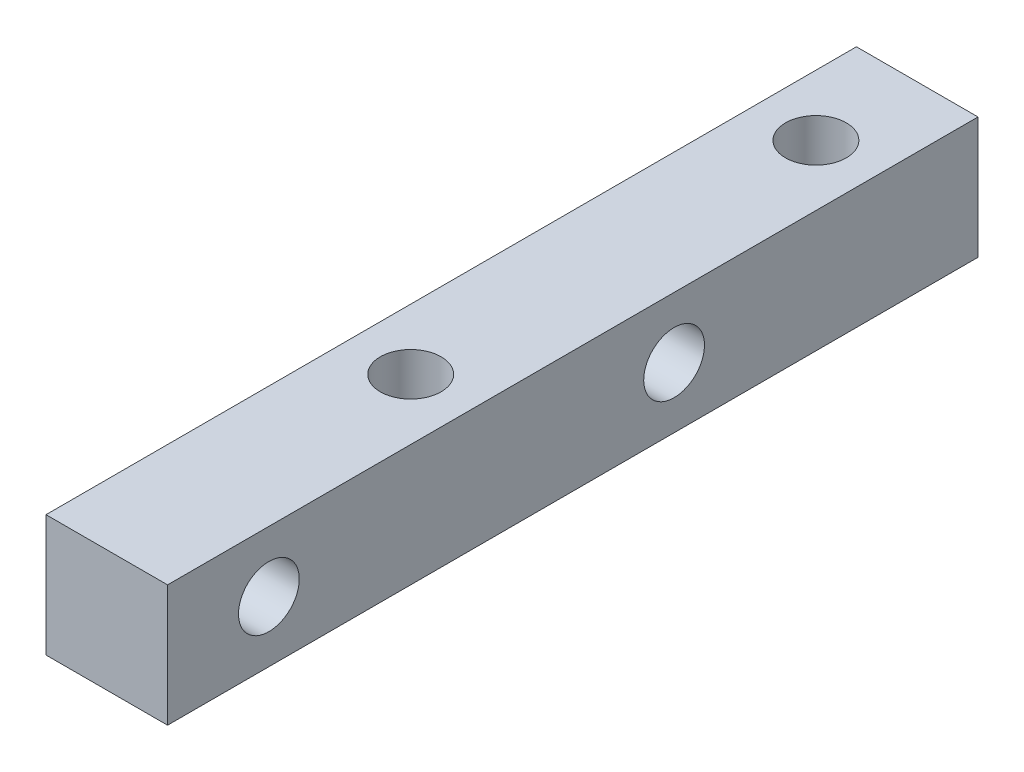
ISO-10303-21;
HEADER;
FILE_DESCRIPTION(('STEP AP214'),'2;1');
FILE_NAME('part.step','',(''),(''),'','','');
FILE_SCHEMA(('AUTOMOTIVE_DESIGN { 1 0 10303 214 1 1 1 1 }'));
ENDSEC;
DATA;
#1=APPLICATION_CONTEXT('core data for automotive mechanical design processes');
#2=APPLICATION_PROTOCOL_DEFINITION('international standard','automotive_design',2000,#1);
#3=PRODUCT_CONTEXT('',#1,'mechanical');
#4=PRODUCT('Part','Part','',(#3));
#5=PRODUCT_RELATED_PRODUCT_CATEGORY('part','',(#4));
#6=PRODUCT_DEFINITION_FORMATION('','',#4);
#7=PRODUCT_DEFINITION_CONTEXT('part definition',#1,'design');
#8=PRODUCT_DEFINITION('design','',#6,#7);
#9=PRODUCT_DEFINITION_SHAPE('','',#8);
#10=(LENGTH_UNIT() NAMED_UNIT(*) SI_UNIT(.MILLI.,.METRE.));
#11=(NAMED_UNIT(*) PLANE_ANGLE_UNIT() SI_UNIT($,.RADIAN.));
#12=(NAMED_UNIT(*) SI_UNIT($,.STERADIAN.) SOLID_ANGLE_UNIT());
#13=UNCERTAINTY_MEASURE_WITH_UNIT(LENGTH_MEASURE(1.E-05),#10,'distance_accuracy_value','');
#14=(GEOMETRIC_REPRESENTATION_CONTEXT(3) GLOBAL_UNCERTAINTY_ASSIGNED_CONTEXT((#13)) GLOBAL_UNIT_ASSIGNED_CONTEXT((#10,
#11,#12)) REPRESENTATION_CONTEXT('',''));
#15=CARTESIAN_POINT('',(0.,0.,0.));
#16=DIRECTION('',(0.,0.,1.));
#17=DIRECTION('',(1.,0.,0.));
#18=AXIS2_PLACEMENT_3D('',#15,#16,#17);
#19=CARTESIAN_POINT('',(3.,3.,20.));
#20=DIRECTION('',(-1.,0.,0.));
#21=DIRECTION('',(0.,-1.,0.));
#22=AXIS2_PLACEMENT_3D('',#19,#20,#21);
#23=PLANE('',#22);
#24=CARTESIAN_POINT('',(3.,0.,15.));
#25=DIRECTION('',(1.,0.,0.));
#26=DIRECTION('',(0.,1.,0.));
#27=AXIS2_PLACEMENT_3D('',#24,#25,#26);
#28=CIRCLE('',#27,1.5);
#29=CARTESIAN_POINT('',(3.,1.5,15.));
#30=VERTEX_POINT('',#29);
#31=EDGE_CURVE('E119',#30,#30,#28,.T.);
#32=ORIENTED_EDGE('',*,*,#31,.F.);
#33=EDGE_LOOP('',(#32));
#34=FACE_BOUND('',#33,.T.);
#35=CARTESIAN_POINT('',(3.,0.,-5.));
#36=DIRECTION('',(1.,0.,0.));
#37=DIRECTION('',(0.,1.,0.));
#38=AXIS2_PLACEMENT_3D('',#35,#36,#37);
#39=CIRCLE('',#38,1.5);
#40=CARTESIAN_POINT('',(3.,1.5,-5.));
#41=VERTEX_POINT('',#40);
#42=EDGE_CURVE('E120',#41,#41,#39,.T.);
#43=ORIENTED_EDGE('',*,*,#42,.F.);
#44=EDGE_LOOP('',(#43));
#45=FACE_BOUND('',#44,.T.);
#46=DIRECTION('',(0.,1.,0.));
#47=VECTOR('',#46,1.);
#48=CARTESIAN_POINT('',(3.,3.,-20.));
#49=LINE('',#48,#47);
#50=CARTESIAN_POINT('',(3.,-3.,-20.));
#51=VERTEX_POINT('',#50);
#52=CARTESIAN_POINT('',(3.,3.,-20.));
#53=VERTEX_POINT('',#52);
#54=EDGE_CURVE('E102',#51,#53,#49,.T.);
#55=ORIENTED_EDGE('',*,*,#54,.T.);
#56=DIRECTION('',(0.,0.,-1.));
#57=VECTOR('',#56,1.);
#58=CARTESIAN_POINT('',(3.,3.,20.));
#59=LINE('',#58,#57);
#60=CARTESIAN_POINT('',(3.,3.,20.));
#61=VERTEX_POINT('',#60);
#62=EDGE_CURVE('E11',#61,#53,#59,.T.);
#63=ORIENTED_EDGE('',*,*,#62,.F.);
#64=DIRECTION('',(0.,1.,0.));
#65=VECTOR('',#64,1.);
#66=CARTESIAN_POINT('',(3.,3.,20.));
#67=LINE('',#66,#65);
#68=CARTESIAN_POINT('',(3.,-3.,20.));
#69=VERTEX_POINT('',#68);
#70=EDGE_CURVE('E90',#69,#61,#67,.T.);
#71=ORIENTED_EDGE('',*,*,#70,.F.);
#72=DIRECTION('',(0.,0.,-1.));
#73=VECTOR('',#72,1.);
#74=CARTESIAN_POINT('',(3.,-3.,20.));
#75=LINE('',#74,#73);
#76=EDGE_CURVE('E98',#69,#51,#75,.T.);
#77=ORIENTED_EDGE('',*,*,#76,.T.);
#78=EDGE_LOOP('',(#55,#63,#71,#77));
#79=FACE_BOUND('',#78,.T.);
#80=ADVANCED_FACE('F39',(#34,#45,#79),#23,.F.);
#81=CARTESIAN_POINT('',(-3.,3.,20.));
#82=DIRECTION('',(0.,-1.,0.));
#83=DIRECTION('',(0.,0.,-1.));
#84=AXIS2_PLACEMENT_3D('',#81,#82,#83);
#85=PLANE('',#84);
#86=CARTESIAN_POINT('',(0.,3.,-15.));
#87=DIRECTION('',(0.,1.,0.));
#88=DIRECTION('',(0.,0.,1.));
#89=AXIS2_PLACEMENT_3D('',#86,#87,#88);
#90=CIRCLE('',#89,1.5);
#91=CARTESIAN_POINT('',(0.,3.,-13.5));
#92=VERTEX_POINT('',#91);
#93=EDGE_CURVE('E131',#92,#92,#90,.T.);
#94=ORIENTED_EDGE('',*,*,#93,.F.);
#95=EDGE_LOOP('',(#94));
#96=FACE_BOUND('',#95,.T.);
#97=CARTESIAN_POINT('',(0.,3.,5.));
#98=DIRECTION('',(0.,1.,0.));
#99=DIRECTION('',(0.,0.,1.));
#100=AXIS2_PLACEMENT_3D('',#97,#98,#99);
#101=CIRCLE('',#100,1.5);
#102=CARTESIAN_POINT('',(0.,3.,6.5));
#103=VERTEX_POINT('',#102);
#104=EDGE_CURVE('E132',#103,#103,#101,.T.);
#105=ORIENTED_EDGE('',*,*,#104,.F.);
#106=EDGE_LOOP('',(#105));
#107=FACE_BOUND('',#106,.T.);
#108=DIRECTION('',(-1.,0.,0.));
#109=VECTOR('',#108,1.);
#110=CARTESIAN_POINT('',(-3.,3.,-20.));
#111=LINE('',#110,#109);
#112=CARTESIAN_POINT('',(-3.,3.,-20.));
#113=VERTEX_POINT('',#112);
#114=EDGE_CURVE('E94',#53,#113,#111,.T.);
#115=ORIENTED_EDGE('',*,*,#114,.T.);
#116=DIRECTION('',(0.,0.,-1.));
#117=VECTOR('',#116,1.);
#118=CARTESIAN_POINT('',(-3.,3.,20.));
#119=LINE('',#118,#117);
#120=CARTESIAN_POINT('',(-3.,3.,20.));
#121=VERTEX_POINT('',#120);
#122=EDGE_CURVE('E47',#121,#113,#119,.T.);
#123=ORIENTED_EDGE('',*,*,#122,.F.);
#124=DIRECTION('',(-1.,0.,0.));
#125=VECTOR('',#124,1.);
#126=CARTESIAN_POINT('',(-3.,3.,20.));
#127=LINE('',#126,#125);
#128=EDGE_CURVE('E85',#61,#121,#127,.T.);
#129=ORIENTED_EDGE('',*,*,#128,.F.);
#130=ORIENTED_EDGE('',*,*,#62,.T.);
#131=EDGE_LOOP('',(#115,#123,#129,#130));
#132=FACE_BOUND('',#131,.T.);
#133=ADVANCED_FACE('F93',(#96,#107,#132),#85,.F.);
#134=CARTESIAN_POINT('',(-3.,3.,20.));
#135=DIRECTION('',(1.,0.,0.));
#136=DIRECTION('',(0.,1.,0.));
#137=AXIS2_PLACEMENT_3D('',#134,#135,#136);
#138=PLANE('',#137);
#139=CARTESIAN_POINT('',(-3.,0.,15.));
#140=DIRECTION('',(1.,0.,0.));
#141=DIRECTION('',(0.,1.,0.));
#142=AXIS2_PLACEMENT_3D('',#139,#140,#141);
#143=CIRCLE('',#142,1.5);
#144=CARTESIAN_POINT('',(-3.,1.5,15.));
#145=VERTEX_POINT('',#144);
#146=EDGE_CURVE('E105',#145,#145,#143,.F.);
#147=ORIENTED_EDGE('',*,*,#146,.F.);
#148=EDGE_LOOP('',(#147));
#149=FACE_BOUND('',#148,.T.);
#150=CARTESIAN_POINT('',(-3.,0.,-5.));
#151=DIRECTION('',(1.,0.,0.));
#152=DIRECTION('',(0.,1.,0.));
#153=AXIS2_PLACEMENT_3D('',#150,#151,#152);
#154=CIRCLE('',#153,1.5);
#155=CARTESIAN_POINT('',(-3.,1.5,-5.));
#156=VERTEX_POINT('',#155);
#157=EDGE_CURVE('E116',#156,#156,#154,.F.);
#158=ORIENTED_EDGE('',*,*,#157,.F.);
#159=EDGE_LOOP('',(#158));
#160=FACE_BOUND('',#159,.T.);
#161=DIRECTION('',(0.,-1.,0.));
#162=VECTOR('',#161,1.);
#163=CARTESIAN_POINT('',(-3.,3.,-20.));
#164=LINE('',#163,#162);
#165=CARTESIAN_POINT('',(-3.,-3.,-20.));
#166=VERTEX_POINT('',#165);
#167=EDGE_CURVE('E72',#113,#166,#164,.T.);
#168=ORIENTED_EDGE('',*,*,#167,.T.);
#169=DIRECTION('',(0.,0.,-1.));
#170=VECTOR('',#169,1.);
#171=CARTESIAN_POINT('',(-3.,-3.,20.));
#172=LINE('',#171,#170);
#173=CARTESIAN_POINT('',(-3.,-3.,20.));
#174=VERTEX_POINT('',#173);
#175=EDGE_CURVE('E95',#174,#166,#172,.T.);
#176=ORIENTED_EDGE('',*,*,#175,.F.);
#177=DIRECTION('',(0.,-1.,0.));
#178=VECTOR('',#177,1.);
#179=CARTESIAN_POINT('',(-3.,3.,20.));
#180=LINE('',#179,#178);
#181=EDGE_CURVE('E88',#121,#174,#180,.T.);
#182=ORIENTED_EDGE('',*,*,#181,.F.);
#183=ORIENTED_EDGE('',*,*,#122,.T.);
#184=EDGE_LOOP('',(#168,#176,#182,#183));
#185=FACE_BOUND('',#184,.T.);
#186=ADVANCED_FACE('F96',(#149,#160,#185),#138,.F.);
#187=CARTESIAN_POINT('',(-3.,-3.,20.));
#188=DIRECTION('',(0.,1.,0.));
#189=DIRECTION('',(0.,0.,1.));
#190=AXIS2_PLACEMENT_3D('',#187,#188,#189);
#191=PLANE('',#190);
#192=CARTESIAN_POINT('',(0.,-3.,-15.));
#193=DIRECTION('',(0.,1.,0.));
#194=DIRECTION('',(0.,0.,1.));
#195=AXIS2_PLACEMENT_3D('',#192,#193,#194);
#196=CIRCLE('',#195,1.5);
#197=CARTESIAN_POINT('',(0.,-3.,-13.5));
#198=VERTEX_POINT('',#197);
#199=EDGE_CURVE('E123',#198,#198,#196,.F.);
#200=ORIENTED_EDGE('',*,*,#199,.F.);
#201=EDGE_LOOP('',(#200));
#202=FACE_BOUND('',#201,.T.);
#203=CARTESIAN_POINT('',(0.,-3.,5.));
#204=DIRECTION('',(0.,1.,0.));
#205=DIRECTION('',(0.,0.,1.));
#206=AXIS2_PLACEMENT_3D('',#203,#204,#205);
#207=CIRCLE('',#206,1.5);
#208=CARTESIAN_POINT('',(0.,-3.,6.5));
#209=VERTEX_POINT('',#208);
#210=EDGE_CURVE('E128',#209,#209,#207,.F.);
#211=ORIENTED_EDGE('',*,*,#210,.F.);
#212=EDGE_LOOP('',(#211));
#213=FACE_BOUND('',#212,.T.);
#214=DIRECTION('',(1.,0.,0.));
#215=VECTOR('',#214,1.);
#216=CARTESIAN_POINT('',(-3.,-3.,-20.));
#217=LINE('',#216,#215);
#218=EDGE_CURVE('E78',#166,#51,#217,.T.);
#219=ORIENTED_EDGE('',*,*,#218,.T.);
#220=ORIENTED_EDGE('',*,*,#76,.F.);
#221=DIRECTION('',(1.,0.,0.));
#222=VECTOR('',#221,1.);
#223=CARTESIAN_POINT('',(-3.,-3.,20.));
#224=LINE('',#223,#222);
#225=EDGE_CURVE('E55',#174,#69,#224,.T.);
#226=ORIENTED_EDGE('',*,*,#225,.F.);
#227=ORIENTED_EDGE('',*,*,#175,.T.);
#228=EDGE_LOOP('',(#219,#220,#226,#227));
#229=FACE_BOUND('',#228,.T.);
#230=ADVANCED_FACE('F110',(#202,#213,#229),#191,.F.);
#231=CARTESIAN_POINT('',(0.,0.,20.));
#232=DIRECTION('',(0.,0.,1.));
#233=DIRECTION('',(1.,0.,0.));
#234=AXIS2_PLACEMENT_3D('',#231,#232,#233);
#235=PLANE('',#234);
#236=ORIENTED_EDGE('',*,*,#70,.T.);
#237=ORIENTED_EDGE('',*,*,#128,.T.);
#238=ORIENTED_EDGE('',*,*,#181,.T.);
#239=ORIENTED_EDGE('',*,*,#225,.T.);
#240=EDGE_LOOP('',(#236,#237,#238,#239));
#241=FACE_BOUND('',#240,.T.);
#242=ADVANCED_FACE('F86',(#241),#235,.T.);
#243=CARTESIAN_POINT('',(0.,0.,-20.));
#244=DIRECTION('',(0.,0.,1.));
#245=DIRECTION('',(1.,0.,0.));
#246=AXIS2_PLACEMENT_3D('',#243,#244,#245);
#247=PLANE('',#246);
#248=ORIENTED_EDGE('',*,*,#54,.F.);
#249=ORIENTED_EDGE('',*,*,#218,.F.);
#250=ORIENTED_EDGE('',*,*,#167,.F.);
#251=ORIENTED_EDGE('',*,*,#114,.F.);
#252=EDGE_LOOP('',(#248,#249,#250,#251));
#253=FACE_BOUND('',#252,.T.);
#254=ADVANCED_FACE('F113',(#253),#247,.F.);
#255=CARTESIAN_POINT('',(-3.001,0.,-5.));
#256=DIRECTION('',(1.,0.,0.));
#257=DIRECTION('',(0.,1.,0.));
#258=AXIS2_PLACEMENT_3D('',#255,#256,#257);
#259=CYLINDRICAL_SURFACE('',#258,1.5);
#260=ORIENTED_EDGE('',*,*,#42,.T.);
#261=EDGE_LOOP('',(#260));
#262=FACE_BOUND('',#261,.T.);
#263=ORIENTED_EDGE('',*,*,#157,.T.);
#264=EDGE_LOOP('',(#263));
#265=FACE_BOUND('',#264,.T.);
#266=ADVANCED_FACE('F175',(#262,#265),#259,.F.);
#267=CARTESIAN_POINT('',(-3.001,0.,15.));
#268=DIRECTION('',(1.,0.,0.));
#269=DIRECTION('',(0.,1.,0.));
#270=AXIS2_PLACEMENT_3D('',#267,#268,#269);
#271=CYLINDRICAL_SURFACE('',#270,1.5);
#272=ORIENTED_EDGE('',*,*,#31,.T.);
#273=EDGE_LOOP('',(#272));
#274=FACE_BOUND('',#273,.T.);
#275=ORIENTED_EDGE('',*,*,#146,.T.);
#276=EDGE_LOOP('',(#275));
#277=FACE_BOUND('',#276,.T.);
#278=ADVANCED_FACE('F150',(#274,#277),#271,.F.);
#279=CARTESIAN_POINT('',(0.,-3.001,5.));
#280=DIRECTION('',(0.,1.,0.));
#281=DIRECTION('',(0.,0.,1.));
#282=AXIS2_PLACEMENT_3D('',#279,#280,#281);
#283=CYLINDRICAL_SURFACE('',#282,1.5);
#284=CARTESIAN_POINT('',(0.,3.,6.5));
#285=CARTESIAN_POINT('',(0.,2.9375,6.5));
#286=CARTESIAN_POINT('',(0.,2.875,6.5));
#287=CARTESIAN_POINT('',(0.,2.75,6.5));
#288=CARTESIAN_POINT('',(0.,2.6875,6.5));
#289=CARTESIAN_POINT('',(0.,2.5625,6.5));
#290=CARTESIAN_POINT('',(0.,2.5,6.5));
#291=CARTESIAN_POINT('',(0.,2.375,6.5));
#292=CARTESIAN_POINT('',(0.,2.3125,6.5));
#293=CARTESIAN_POINT('',(0.,2.1875,6.5));
#294=CARTESIAN_POINT('',(0.,2.125,6.5));
#295=CARTESIAN_POINT('',(0.,2.,6.5));
#296=CARTESIAN_POINT('',(0.,1.9375,6.5));
#297=CARTESIAN_POINT('',(0.,1.8125,6.5));
#298=CARTESIAN_POINT('',(0.,1.75,6.5));
#299=CARTESIAN_POINT('',(0.,1.625,6.5));
#300=CARTESIAN_POINT('',(0.,1.5625,6.5));
#301=CARTESIAN_POINT('',(0.,1.4375,6.5));
#302=CARTESIAN_POINT('',(0.,1.375,6.5));
#303=CARTESIAN_POINT('',(0.,1.25,6.5));
#304=CARTESIAN_POINT('',(0.,1.1875,6.5));
#305=CARTESIAN_POINT('',(0.,1.0625,6.5));
#306=CARTESIAN_POINT('',(0.,1.,6.5));
#307=CARTESIAN_POINT('',(0.,0.875,6.5));
#308=CARTESIAN_POINT('',(0.,0.8125,6.5));
#309=CARTESIAN_POINT('',(0.,0.6875,6.5));
#310=CARTESIAN_POINT('',(0.,0.625,6.5));
#311=CARTESIAN_POINT('',(0.,0.5,6.5));
#312=CARTESIAN_POINT('',(0.,0.4375,6.5));
#313=CARTESIAN_POINT('',(0.,0.3125,6.5));
#314=CARTESIAN_POINT('',(0.,0.25,6.5));
#315=CARTESIAN_POINT('',(0.,0.125,6.5));
#316=CARTESIAN_POINT('',(0.,0.0625,6.5));
#317=CARTESIAN_POINT('',(0.,-0.0625,6.5));
#318=CARTESIAN_POINT('',(0.,-0.125,6.5));
#319=CARTESIAN_POINT('',(0.,-0.25,6.5));
#320=CARTESIAN_POINT('',(0.,-0.3125,6.5));
#321=CARTESIAN_POINT('',(0.,-0.4375,6.5));
#322=CARTESIAN_POINT('',(0.,-0.5,6.5));
#323=CARTESIAN_POINT('',(0.,-0.625,6.5));
#324=CARTESIAN_POINT('',(0.,-0.6875,6.5));
#325=CARTESIAN_POINT('',(0.,-0.8125,6.5));
#326=CARTESIAN_POINT('',(0.,-0.875,6.5));
#327=CARTESIAN_POINT('',(0.,-1.,6.5));
#328=CARTESIAN_POINT('',(0.,-1.0625,6.5));
#329=CARTESIAN_POINT('',(0.,-1.1875,6.5));
#330=CARTESIAN_POINT('',(0.,-1.25,6.5));
#331=CARTESIAN_POINT('',(0.,-1.375,6.5));
#332=CARTESIAN_POINT('',(0.,-1.4375,6.5));
#333=CARTESIAN_POINT('',(0.,-1.5625,6.5));
#334=CARTESIAN_POINT('',(0.,-1.625,6.5));
#335=CARTESIAN_POINT('',(0.,-1.75,6.5));
#336=CARTESIAN_POINT('',(0.,-1.8125,6.5));
#337=CARTESIAN_POINT('',(0.,-1.9375,6.5));
#338=CARTESIAN_POINT('',(0.,-2.,6.5));
#339=CARTESIAN_POINT('',(0.,-2.125,6.5));
#340=CARTESIAN_POINT('',(0.,-2.1875,6.5));
#341=CARTESIAN_POINT('',(0.,-2.3125,6.5));
#342=CARTESIAN_POINT('',(0.,-2.375,6.5));
#343=CARTESIAN_POINT('',(0.,-2.5,6.5));
#344=CARTESIAN_POINT('',(0.,-2.5625,6.5));
#345=CARTESIAN_POINT('',(0.,-2.6875,6.5));
#346=CARTESIAN_POINT('',(0.,-2.75,6.5));
#347=CARTESIAN_POINT('',(0.,-2.875,6.5));
#348=CARTESIAN_POINT('',(0.,-2.9375,6.5));
#349=CARTESIAN_POINT('',(0.,-3.,6.5));
#350=B_SPLINE_CURVE_WITH_KNOTS('',3,(#284,#285,#286,#287,#288,#289,#290,#291,#292,#293,#294,
#295,#296,#297,#298,#299,#300,#301,#302,#303,#304,#305,#306,#307,#308,#309,#310,#311,#312,#313,
#314,#315,#316,#317,#318,#319,#320,#321,#322,#323,#324,#325,#326,#327,#328,#329,#330,#331,#332,
#333,#334,#335,#336,#337,#338,#339,#340,#341,#342,#343,#344,#345,#346,#347,#348,#349),
.UNSPECIFIED.,.F.,.F.,(4,2,2,2,2,2,2,2,2,2,2,2,2,2,2,2,2,2,2,2,2,2,2,2,2,2,2,2,2,2,2,2,4),(0.,
0.1875,0.375,0.5625,0.75,0.9375,1.125,1.3125,1.5,1.6875,1.875,2.0625,2.25,2.4375,2.625,2.8125,
3.,3.1875,3.375,3.5625,3.75,3.9375,4.125,4.3125,4.5,4.6875,4.875,5.0625,5.25,5.4375,5.625,
5.8125,6.),.UNSPECIFIED.);
#351=EDGE_CURVE('BSEAM147',#103,#209,#350,.T.);
#352=ORIENTED_EDGE('',*,*,#104,.T.);
#353=ORIENTED_EDGE('',*,*,#210,.T.);
#354=ORIENTED_EDGE('',*,*,#351,.T.);
#355=ORIENTED_EDGE('',*,*,#351,.F.);
#356=EDGE_LOOP('',(#352,#354,#353,#355));
#357=FACE_BOUND('',#356,.T.);
#358=ADVANCED_FACE('F147',(#357),#283,.F.);
#359=CARTESIAN_POINT('',(0.,-3.001,-15.));
#360=DIRECTION('',(0.,1.,0.));
#361=DIRECTION('',(0.,0.,1.));
#362=AXIS2_PLACEMENT_3D('',#359,#360,#361);
#363=CYLINDRICAL_SURFACE('',#362,1.5);
#364=CARTESIAN_POINT('',(0.,3.,-13.5));
#365=CARTESIAN_POINT('',(0.,2.9375,-13.5));
#366=CARTESIAN_POINT('',(0.,2.875,-13.5));
#367=CARTESIAN_POINT('',(0.,2.75,-13.5));
#368=CARTESIAN_POINT('',(0.,2.6875,-13.5));
#369=CARTESIAN_POINT('',(0.,2.5625,-13.5));
#370=CARTESIAN_POINT('',(0.,2.5,-13.5));
#371=CARTESIAN_POINT('',(0.,2.375,-13.5));
#372=CARTESIAN_POINT('',(0.,2.3125,-13.5));
#373=CARTESIAN_POINT('',(0.,2.1875,-13.5));
#374=CARTESIAN_POINT('',(0.,2.125,-13.5));
#375=CARTESIAN_POINT('',(0.,2.,-13.5));
#376=CARTESIAN_POINT('',(0.,1.9375,-13.5));
#377=CARTESIAN_POINT('',(0.,1.8125,-13.5));
#378=CARTESIAN_POINT('',(0.,1.75,-13.5));
#379=CARTESIAN_POINT('',(0.,1.625,-13.5));
#380=CARTESIAN_POINT('',(0.,1.5625,-13.5));
#381=CARTESIAN_POINT('',(0.,1.4375,-13.5));
#382=CARTESIAN_POINT('',(0.,1.375,-13.5));
#383=CARTESIAN_POINT('',(0.,1.25,-13.5));
#384=CARTESIAN_POINT('',(0.,1.1875,-13.5));
#385=CARTESIAN_POINT('',(0.,1.0625,-13.5));
#386=CARTESIAN_POINT('',(0.,1.,-13.5));
#387=CARTESIAN_POINT('',(0.,0.875,-13.5));
#388=CARTESIAN_POINT('',(0.,0.8125,-13.5));
#389=CARTESIAN_POINT('',(0.,0.6875,-13.5));
#390=CARTESIAN_POINT('',(0.,0.625,-13.5));
#391=CARTESIAN_POINT('',(0.,0.5,-13.5));
#392=CARTESIAN_POINT('',(0.,0.4375,-13.5));
#393=CARTESIAN_POINT('',(0.,0.3125,-13.5));
#394=CARTESIAN_POINT('',(0.,0.25,-13.5));
#395=CARTESIAN_POINT('',(0.,0.125,-13.5));
#396=CARTESIAN_POINT('',(0.,0.0625,-13.5));
#397=CARTESIAN_POINT('',(0.,-0.0625,-13.5));
#398=CARTESIAN_POINT('',(0.,-0.125,-13.5));
#399=CARTESIAN_POINT('',(0.,-0.25,-13.5));
#400=CARTESIAN_POINT('',(0.,-0.3125,-13.5));
#401=CARTESIAN_POINT('',(0.,-0.4375,-13.5));
#402=CARTESIAN_POINT('',(0.,-0.5,-13.5));
#403=CARTESIAN_POINT('',(0.,-0.625,-13.5));
#404=CARTESIAN_POINT('',(0.,-0.6875,-13.5));
#405=CARTESIAN_POINT('',(0.,-0.8125,-13.5));
#406=CARTESIAN_POINT('',(0.,-0.875,-13.5));
#407=CARTESIAN_POINT('',(0.,-1.,-13.5));
#408=CARTESIAN_POINT('',(0.,-1.0625,-13.5));
#409=CARTESIAN_POINT('',(0.,-1.1875,-13.5));
#410=CARTESIAN_POINT('',(0.,-1.25,-13.5));
#411=CARTESIAN_POINT('',(0.,-1.375,-13.5));
#412=CARTESIAN_POINT('',(0.,-1.4375,-13.5));
#413=CARTESIAN_POINT('',(0.,-1.5625,-13.5));
#414=CARTESIAN_POINT('',(0.,-1.625,-13.5));
#415=CARTESIAN_POINT('',(0.,-1.75,-13.5));
#416=CARTESIAN_POINT('',(0.,-1.8125,-13.5));
#417=CARTESIAN_POINT('',(0.,-1.9375,-13.5));
#418=CARTESIAN_POINT('',(0.,-2.,-13.5));
#419=CARTESIAN_POINT('',(0.,-2.125,-13.5));
#420=CARTESIAN_POINT('',(0.,-2.1875,-13.5));
#421=CARTESIAN_POINT('',(0.,-2.3125,-13.5));
#422=CARTESIAN_POINT('',(0.,-2.375,-13.5));
#423=CARTESIAN_POINT('',(0.,-2.5,-13.5));
#424=CARTESIAN_POINT('',(0.,-2.5625,-13.5));
#425=CARTESIAN_POINT('',(0.,-2.6875,-13.5));
#426=CARTESIAN_POINT('',(0.,-2.75,-13.5));
#427=CARTESIAN_POINT('',(0.,-2.875,-13.5));
#428=CARTESIAN_POINT('',(0.,-2.9375,-13.5));
#429=CARTESIAN_POINT('',(0.,-3.,-13.5));
#430=B_SPLINE_CURVE_WITH_KNOTS('',3,(#364,#365,#366,#367,#368,#369,#370,#371,#372,#373,#374,
#375,#376,#377,#378,#379,#380,#381,#382,#383,#384,#385,#386,#387,#388,#389,#390,#391,#392,#393,
#394,#395,#396,#397,#398,#399,#400,#401,#402,#403,#404,#405,#406,#407,#408,#409,#410,#411,#412,
#413,#414,#415,#416,#417,#418,#419,#420,#421,#422,#423,#424,#425,#426,#427,#428,#429),
.UNSPECIFIED.,.F.,.F.,(4,2,2,2,2,2,2,2,2,2,2,2,2,2,2,2,2,2,2,2,2,2,2,2,2,2,2,2,2,2,2,2,4),(0.,
0.1875,0.375,0.5625,0.75,0.9375,1.125,1.3125,1.5,1.6875,1.875,2.0625,2.25,2.4375,2.625,2.8125,
3.,3.1875,3.375,3.5625,3.75,3.9375,4.125,4.3125,4.5,4.6875,4.875,5.0625,5.25,5.4375,5.625,
5.8125,6.),.UNSPECIFIED.);
#431=EDGE_CURVE('BSEAM140',#92,#198,#430,.T.);
#432=ORIENTED_EDGE('',*,*,#93,.T.);
#433=ORIENTED_EDGE('',*,*,#199,.T.);
#434=ORIENTED_EDGE('',*,*,#431,.T.);
#435=ORIENTED_EDGE('',*,*,#431,.F.);
#436=EDGE_LOOP('',(#432,#434,#433,#435));
#437=FACE_BOUND('',#436,.T.);
#438=ADVANCED_FACE('F140',(#437),#363,.F.);
#439=CLOSED_SHELL('',(#80,#133,#186,#230,#242,#254,#266,#278,#358,#438));
#440=MANIFOLD_SOLID_BREP('B2',#439);
#441=ADVANCED_BREP_SHAPE_REPRESENTATION('',(#18,#440),#14);
#442=SHAPE_DEFINITION_REPRESENTATION(#9,#441);
ENDSEC;
END-ISO-10303-21;
